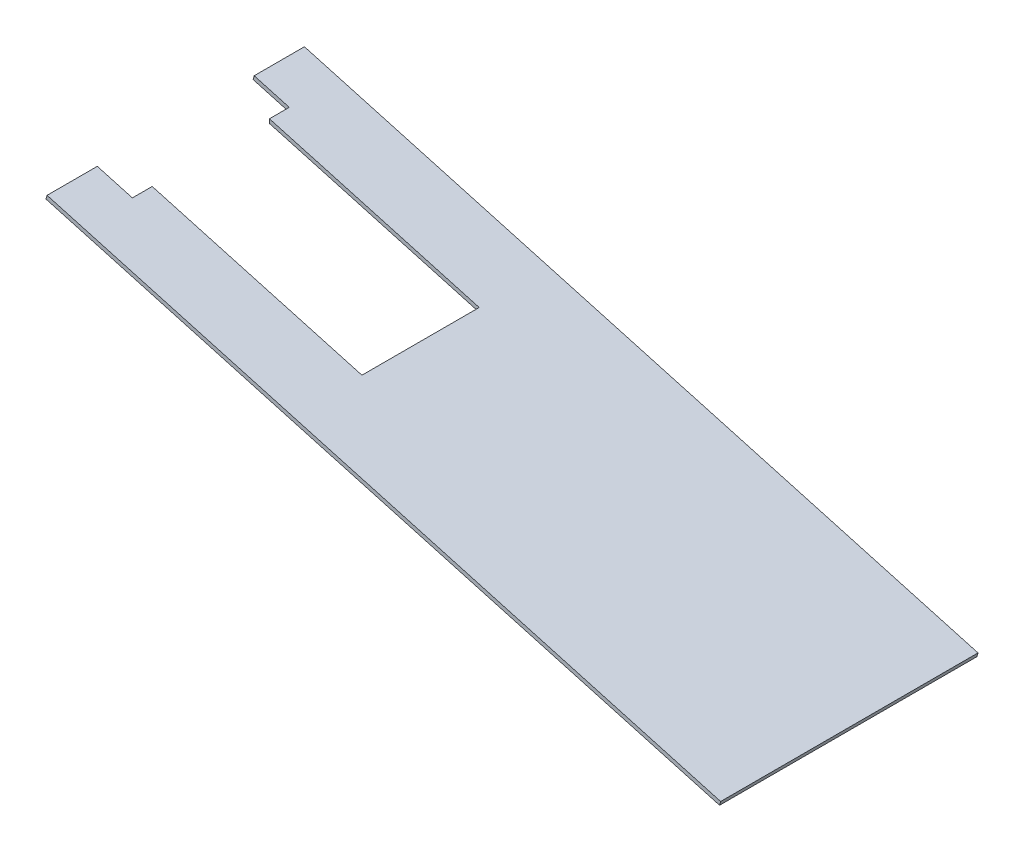
ISO-10303-21;
HEADER;
FILE_DESCRIPTION(('STEP AP214'),'2;1');
FILE_NAME('part.step','',(''),(''),'','','');
FILE_SCHEMA(('AUTOMOTIVE_DESIGN { 1 0 10303 214 1 1 1 1 }'));
ENDSEC;
DATA;
#1=APPLICATION_CONTEXT('core data for automotive mechanical design processes');
#2=APPLICATION_PROTOCOL_DEFINITION('international standard','automotive_design',2000,#1);
#3=PRODUCT_CONTEXT('',#1,'mechanical');
#4=PRODUCT('Part','Part','',(#3));
#5=PRODUCT_RELATED_PRODUCT_CATEGORY('part','',(#4));
#6=PRODUCT_DEFINITION_FORMATION('','',#4);
#7=PRODUCT_DEFINITION_CONTEXT('part definition',#1,'design');
#8=PRODUCT_DEFINITION('design','',#6,#7);
#9=PRODUCT_DEFINITION_SHAPE('','',#8);
#10=(LENGTH_UNIT() NAMED_UNIT(*) SI_UNIT(.MILLI.,.METRE.));
#11=(NAMED_UNIT(*) PLANE_ANGLE_UNIT() SI_UNIT($,.RADIAN.));
#12=(NAMED_UNIT(*) SI_UNIT($,.STERADIAN.) SOLID_ANGLE_UNIT());
#13=UNCERTAINTY_MEASURE_WITH_UNIT(LENGTH_MEASURE(1.E-05),#10,'distance_accuracy_value','');
#14=(GEOMETRIC_REPRESENTATION_CONTEXT(3) GLOBAL_UNCERTAINTY_ASSIGNED_CONTEXT((#13)) GLOBAL_UNIT_ASSIGNED_CONTEXT((#10,
#11,#12)) REPRESENTATION_CONTEXT('',''));
#15=CARTESIAN_POINT('',(0.,0.,0.));
#16=DIRECTION('',(0.,0.,1.));
#17=DIRECTION('',(1.,0.,0.));
#18=AXIS2_PLACEMENT_3D('',#15,#16,#17);
#19=CARTESIAN_POINT('',(-63.4786859186257,0.,0.));
#20=DIRECTION('',(1.,0.,0.));
#21=DIRECTION('',(0.,1.,0.));
#22=AXIS2_PLACEMENT_3D('',#19,#20,#21);
#23=PLANE('',#22);
#24=DIRECTION('',(0.,0.,-1.));
#25=VECTOR('',#24,1.);
#26=CARTESIAN_POINT('',(-63.4786859186257,42.8489765519579,130.));
#27=LINE('',#26,#25);
#28=CARTESIAN_POINT('',(-63.4786859186257,42.8489765519579,35.3784747554512));
#29=VERTEX_POINT('',#28);
#30=CARTESIAN_POINT('',(-63.4786859186258,42.8489765519579,25.3784747554512));
#31=VERTEX_POINT('',#30);
#32=EDGE_CURVE('E199',#29,#31,#27,.T.);
#33=ORIENTED_EDGE('',*,*,#32,.F.);
#34=DIRECTION('',(0.,1.,0.));
#35=VECTOR('',#34,1.);
#36=CARTESIAN_POINT('',(-63.4786859186257,0.,35.3784747554512));
#37=LINE('',#36,#35);
#38=CARTESIAN_POINT('',(-63.4786859186257,44.9255362360795,35.3784747554512));
#39=VERTEX_POINT('',#38);
#40=EDGE_CURVE('E11',#29,#39,#37,.T.);
#41=ORIENTED_EDGE('',*,*,#40,.T.);
#42=DIRECTION('',(0.,0.,1.));
#43=VECTOR('',#42,1.);
#44=CARTESIAN_POINT('',(-63.4786859186257,44.9255362360795,130.));
#45=LINE('',#44,#43);
#46=CARTESIAN_POINT('',(-63.4786859186258,44.9255362360795,25.3784747554512));
#47=VERTEX_POINT('',#46);
#48=EDGE_CURVE('E163',#47,#39,#45,.T.);
#49=ORIENTED_EDGE('',*,*,#48,.F.);
#50=DIRECTION('',(0.,-1.,0.));
#51=VECTOR('',#50,1.);
#52=CARTESIAN_POINT('',(-63.4786859186258,57.5782483332973,25.3784747554512));
#53=LINE('',#52,#51);
#54=EDGE_CURVE('E235',#47,#31,#53,.T.);
#55=ORIENTED_EDGE('',*,*,#54,.T.);
#56=EDGE_LOOP('',(#33,#41,#49,#55));
#57=FACE_BOUND('',#56,.T.);
#58=ADVANCED_FACE('F48',(#57),#23,.F.);
#59=CARTESIAN_POINT('',(-99.346696613791,52.8679739528421,130.));
#60=DIRECTION('',(0.269031139412408,0.963131479096422,0.));
#61=DIRECTION('',(-0.963131479096422,0.269031139412408,0.));
#62=AXIS2_PLACEMENT_3D('',#59,#60,#61);
#63=PLANE('',#62);
#64=DIRECTION('',(0.,0.,-1.));
#65=VECTOR('',#64,1.);
#66=CARTESIAN_POINT('',(41.9277145031559,13.4058479425217,130.));
#67=LINE('',#66,#65);
#68=CARTESIAN_POINT('',(41.9277145031559,13.4058479425217,94.6215252445487));
#69=VERTEX_POINT('',#68);
#70=CARTESIAN_POINT('',(41.9277145031558,13.4058479425217,35.3784747554512));
#71=VERTEX_POINT('',#70);
#72=EDGE_CURVE('E255',#69,#71,#67,.T.);
#73=ORIENTED_EDGE('',*,*,#72,.T.);
#74=DIRECTION('',(-0.963131479096422,0.269031139412408,0.));
#75=VECTOR('',#74,1.);
#76=CARTESIAN_POINT('',(-99.346696613791,52.8679739528421,35.3784747554512));
#77=LINE('',#76,#75);
#78=EDGE_CURVE('E259',#71,#29,#77,.T.);
#79=ORIENTED_EDGE('',*,*,#78,.T.);
#80=ORIENTED_EDGE('',*,*,#32,.T.);
#81=DIRECTION('',(-0.963131479096422,0.269031139412408,0.));
#82=VECTOR('',#81,1.);
#83=CARTESIAN_POINT('',(-99.346696613791,52.8679739528421,25.3784747554512));
#84=LINE('',#83,#82);
#85=CARTESIAN_POINT('',(-81.7434214219124,47.950857977457,25.3784747554512));
#86=VERTEX_POINT('',#85);
#87=EDGE_CURVE('E187',#31,#86,#84,.T.);
#88=ORIENTED_EDGE('',*,*,#87,.T.);
#89=DIRECTION('',(0.,0.,-1.));
#90=VECTOR('',#89,1.);
#91=CARTESIAN_POINT('',(-81.7434214219124,47.950857977457,130.));
#92=LINE('',#91,#90);
#93=CARTESIAN_POINT('',(-81.7434214219124,47.950857977457,0.));
#94=VERTEX_POINT('',#93);
#95=EDGE_CURVE('E72',#86,#94,#92,.T.);
#96=ORIENTED_EDGE('',*,*,#95,.T.);
#97=DIRECTION('',(0.963131479096422,-0.269031139412408,0.));
#98=VECTOR('',#97,1.);
#99=CARTESIAN_POINT('',(-99.346696613791,52.8679739528421,0.));
#100=LINE('',#99,#98);
#101=CARTESIAN_POINT('',(258.521314081374,-47.0951575262544,0.));
#102=VERTEX_POINT('',#101);
#103=EDGE_CURVE('E203',#94,#102,#100,.T.);
#104=ORIENTED_EDGE('',*,*,#103,.T.);
#105=DIRECTION('',(0.,0.,-1.));
#106=VECTOR('',#105,1.);
#107=CARTESIAN_POINT('',(258.521314081374,-47.0951575262544,130.));
#108=LINE('',#107,#106);
#109=CARTESIAN_POINT('',(258.521314081374,-47.0951575262544,130.));
#110=VERTEX_POINT('',#109);
#111=EDGE_CURVE('E164',#110,#102,#108,.T.);
#112=ORIENTED_EDGE('',*,*,#111,.F.);
#113=DIRECTION('',(0.963131479096422,-0.269031139412408,0.));
#114=VECTOR('',#113,1.);
#115=CARTESIAN_POINT('',(-99.346696613791,52.8679739528421,130.));
#116=LINE('',#115,#114);
#117=CARTESIAN_POINT('',(-81.7434214219124,47.950857977457,130.));
#118=VERTEX_POINT('',#117);
#119=EDGE_CURVE('E204',#118,#110,#116,.T.);
#120=ORIENTED_EDGE('',*,*,#119,.F.);
#121=CARTESIAN_POINT('',(-81.7434214219124,47.950857977457,104.621525244549));
#122=VERTEX_POINT('',#121);
#123=EDGE_CURVE('E243',#118,#122,#92,.T.);
#124=ORIENTED_EDGE('',*,*,#123,.T.);
#125=DIRECTION('',(0.963131479096422,-0.269031139412408,0.));
#126=VECTOR('',#125,1.);
#127=CARTESIAN_POINT('',(-99.346696613791,52.8679739528421,104.621525244549));
#128=LINE('',#127,#126);
#129=CARTESIAN_POINT('',(-63.4786859186258,42.8489765519579,104.621525244549));
#130=VERTEX_POINT('',#129);
#131=EDGE_CURVE('E179',#122,#130,#128,.T.);
#132=ORIENTED_EDGE('',*,*,#131,.T.);
#133=CARTESIAN_POINT('',(-63.4786859186257,42.8489765519579,94.6215252445488));
#134=VERTEX_POINT('',#133);
#135=EDGE_CURVE('E200',#130,#134,#27,.T.);
#136=ORIENTED_EDGE('',*,*,#135,.T.);
#137=DIRECTION('',(0.963131479096422,-0.269031139412408,0.));
#138=VECTOR('',#137,1.);
#139=CARTESIAN_POINT('',(-99.346696613791,52.8679739528421,94.6215252445487));
#140=LINE('',#139,#138);
#141=EDGE_CURVE('E64',#134,#69,#140,.T.);
#142=ORIENTED_EDGE('',*,*,#141,.T.);
#143=EDGE_LOOP('',(#73,#79,#80,#88,#96,#104,#112,#120,#124,#132,#136,#142));
#144=FACE_BOUND('',#143,.T.);
#145=ADVANCED_FACE('F50',(#144),#63,.F.);
#146=CARTESIAN_POINT('',(258.521314081374,-47.0951575262544,130.));
#147=DIRECTION('',(-0.963131479096424,0.269031139412401,0.));
#148=DIRECTION('',(-0.269031139412401,-0.963131479096424,0.));
#149=AXIS2_PLACEMENT_3D('',#146,#147,#148);
#150=PLANE('',#149);
#151=DIRECTION('',(0.269031139412401,0.963131479096424,0.));
#152=VECTOR('',#151,1.);
#153=CARTESIAN_POINT('',(258.521314081374,-47.0951575262544,0.));
#154=LINE('',#153,#152);
#155=CARTESIAN_POINT('',(259.059376360199,-45.1688945680615,0.));
#156=VERTEX_POINT('',#155);
#157=EDGE_CURVE('E216',#102,#156,#154,.T.);
#158=ORIENTED_EDGE('',*,*,#157,.T.);
#159=DIRECTION('',(0.,0.,-1.));
#160=VECTOR('',#159,1.);
#161=CARTESIAN_POINT('',(259.059376360199,-45.1688945680615,130.));
#162=LINE('',#161,#160);
#163=CARTESIAN_POINT('',(259.059376360199,-45.1688945680615,130.));
#164=VERTEX_POINT('',#163);
#165=EDGE_CURVE('E169',#164,#156,#162,.T.);
#166=ORIENTED_EDGE('',*,*,#165,.F.);
#167=DIRECTION('',(0.269031139412401,0.963131479096424,0.));
#168=VECTOR('',#167,1.);
#169=CARTESIAN_POINT('',(258.521314081374,-47.0951575262544,130.));
#170=LINE('',#169,#168);
#171=EDGE_CURVE('E207',#110,#164,#170,.T.);
#172=ORIENTED_EDGE('',*,*,#171,.F.);
#173=ORIENTED_EDGE('',*,*,#111,.T.);
#174=EDGE_LOOP('',(#158,#166,#172,#173));
#175=FACE_BOUND('',#174,.T.);
#176=ADVANCED_FACE('F305',(#175),#150,.F.);
#177=CARTESIAN_POINT('',(259.059376360199,-45.1688945680615,130.));
#178=DIRECTION('',(-0.269031139412408,-0.963131479096422,0.));
#179=DIRECTION('',(0.963131479096422,-0.269031139412408,0.));
#180=AXIS2_PLACEMENT_3D('',#177,#178,#179);
#181=PLANE('',#180);
#182=ORIENTED_EDGE('',*,*,#48,.T.);
#183=DIRECTION('',(-0.963131479096422,0.269031139412408,0.));
#184=VECTOR('',#183,1.);
#185=CARTESIAN_POINT('',(-63.4786859186257,44.9255362360795,35.3784747554512));
#186=LINE('',#185,#184);
#187=CARTESIAN_POINT('',(42.4657767819807,15.3321109007146,35.3784747554512));
#188=VERTEX_POINT('',#187);
#189=EDGE_CURVE('E269',#188,#39,#186,.T.);
#190=ORIENTED_EDGE('',*,*,#189,.F.);
#191=DIRECTION('',(0.,0.,-1.));
#192=VECTOR('',#191,1.);
#193=CARTESIAN_POINT('',(42.4657767819807,15.3321109007146,35.3784747554512));
#194=LINE('',#193,#192);
#195=CARTESIAN_POINT('',(42.4657767819807,15.3321109007146,94.6215252445487));
#196=VERTEX_POINT('',#195);
#197=EDGE_CURVE('E155',#196,#188,#194,.T.);
#198=ORIENTED_EDGE('',*,*,#197,.F.);
#199=DIRECTION('',(0.963131479096422,-0.269031139412408,0.));
#200=VECTOR('',#199,1.);
#201=CARTESIAN_POINT('',(-63.4786859186257,44.9255362360795,94.6215252445487));
#202=LINE('',#201,#200);
#203=CARTESIAN_POINT('',(-63.4786859186257,44.9255362360795,94.6215252445487));
#204=VERTEX_POINT('',#203);
#205=EDGE_CURVE('E139',#204,#196,#202,.T.);
#206=ORIENTED_EDGE('',*,*,#205,.F.);
#207=CARTESIAN_POINT('',(-63.4786859186258,44.9255362360795,104.621525244549));
#208=VERTEX_POINT('',#207);
#209=EDGE_CURVE('E151',#204,#208,#45,.T.);
#210=ORIENTED_EDGE('',*,*,#209,.T.);
#211=DIRECTION('',(-0.963131479096422,0.269031139412408,0.));
#212=VECTOR('',#211,1.);
#213=CARTESIAN_POINT('',(259.059376360199,-45.1688945680615,104.621525244549));
#214=LINE('',#213,#212);
#215=CARTESIAN_POINT('',(-81.2053591430877,49.8771209356498,104.621525244549));
#216=VERTEX_POINT('',#215);
#217=EDGE_CURVE('E178',#208,#216,#214,.T.);
#218=ORIENTED_EDGE('',*,*,#217,.T.);
#219=DIRECTION('',(0.,0.,-1.));
#220=VECTOR('',#219,1.);
#221=CARTESIAN_POINT('',(-81.2053591430876,49.8771209356498,-39.8920945915401));
#222=LINE('',#221,#220);
#223=CARTESIAN_POINT('',(-81.2053591430876,49.8771209356498,130.));
#224=VERTEX_POINT('',#223);
#225=EDGE_CURVE('E184',#224,#216,#222,.T.);
#226=ORIENTED_EDGE('',*,*,#225,.F.);
#227=DIRECTION('',(-0.963131479096422,0.269031139412408,0.));
#228=VECTOR('',#227,1.);
#229=CARTESIAN_POINT('',(259.059376360199,-45.1688945680615,130.));
#230=LINE('',#229,#228);
#231=EDGE_CURVE('E211',#164,#224,#230,.T.);
#232=ORIENTED_EDGE('',*,*,#231,.F.);
#233=ORIENTED_EDGE('',*,*,#165,.T.);
#234=DIRECTION('',(-0.963131479096422,0.269031139412408,0.));
#235=VECTOR('',#234,1.);
#236=CARTESIAN_POINT('',(259.059376360199,-45.1688945680615,0.));
#237=LINE('',#236,#235);
#238=CARTESIAN_POINT('',(-81.2053591430876,49.8771209356498,0.));
#239=VERTEX_POINT('',#238);
#240=EDGE_CURVE('E208',#156,#239,#237,.T.);
#241=ORIENTED_EDGE('',*,*,#240,.T.);
#242=CARTESIAN_POINT('',(-81.2053591430876,49.8771209356498,25.3784747554512));
#243=VERTEX_POINT('',#242);
#244=EDGE_CURVE('E252',#243,#239,#222,.T.);
#245=ORIENTED_EDGE('',*,*,#244,.F.);
#246=DIRECTION('',(0.963131479096422,-0.269031139412408,0.));
#247=VECTOR('',#246,1.);
#248=CARTESIAN_POINT('',(259.059376360199,-45.1688945680615,25.3784747554512));
#249=LINE('',#248,#247);
#250=EDGE_CURVE('E192',#243,#47,#249,.T.);
#251=ORIENTED_EDGE('',*,*,#250,.T.);
#252=EDGE_LOOP('',(#182,#190,#198,#206,#210,#218,#226,#232,#233,#241,#245,#251));
#253=FACE_BOUND('',#252,.T.);
#254=ADVANCED_FACE('F149',(#253),#181,.F.);
#255=CARTESIAN_POINT('',(-99.6157277532034,51.9048424737456,130.));
#256=DIRECTION('',(0.,0.,1.));
#257=DIRECTION('',(1.,0.,0.));
#258=AXIS2_PLACEMENT_3D('',#255,#256,#257);
#259=PLANE('',#258);
#260=DIRECTION('',(0.269031139412408,0.963131479096422,0.));
#261=VECTOR('',#260,1.);
#262=CARTESIAN_POINT('',(-82.0124525613248,46.9877264983606,130.));
#263=LINE('',#262,#261);
#264=EDGE_CURVE('E248',#118,#224,#263,.T.);
#265=ORIENTED_EDGE('',*,*,#264,.F.);
#266=ORIENTED_EDGE('',*,*,#119,.T.);
#267=ORIENTED_EDGE('',*,*,#171,.T.);
#268=ORIENTED_EDGE('',*,*,#231,.T.);
#269=EDGE_LOOP('',(#265,#266,#267,#268));
#270=FACE_BOUND('',#269,.T.);
#271=ADVANCED_FACE('F314',(#270),#259,.T.);
#272=CARTESIAN_POINT('',(-99.6157277532034,51.9048424737456,0.));
#273=DIRECTION('',(0.,0.,1.));
#274=DIRECTION('',(1.,0.,0.));
#275=AXIS2_PLACEMENT_3D('',#272,#273,#274);
#276=PLANE('',#275);
#277=ORIENTED_EDGE('',*,*,#103,.F.);
#278=DIRECTION('',(0.269031139412408,0.963131479096422,0.));
#279=VECTOR('',#278,1.);
#280=CARTESIAN_POINT('',(-82.0124525613248,46.9877264983606,0.));
#281=LINE('',#280,#279);
#282=EDGE_CURVE('E233',#94,#239,#281,.T.);
#283=ORIENTED_EDGE('',*,*,#282,.T.);
#284=ORIENTED_EDGE('',*,*,#240,.F.);
#285=ORIENTED_EDGE('',*,*,#157,.F.);
#286=EDGE_LOOP('',(#277,#283,#284,#285));
#287=FACE_BOUND('',#286,.T.);
#288=ADVANCED_FACE('F232',(#287),#276,.F.);
#289=ORIENTED_EDGE('',*,*,#209,.F.);
#290=DIRECTION('',(0.,-1.,0.));
#291=VECTOR('',#290,1.);
#292=CARTESIAN_POINT('',(-63.4786859186257,0.,94.6215252445487));
#293=LINE('',#292,#291);
#294=EDGE_CURVE('E57',#204,#134,#293,.T.);
#295=ORIENTED_EDGE('',*,*,#294,.T.);
#296=ORIENTED_EDGE('',*,*,#135,.F.);
#297=DIRECTION('',(0.,1.,0.));
#298=VECTOR('',#297,1.);
#299=CARTESIAN_POINT('',(-63.4786859186258,57.5782483332973,104.621525244549));
#300=LINE('',#299,#298);
#301=EDGE_CURVE('E161',#130,#208,#300,.T.);
#302=ORIENTED_EDGE('',*,*,#301,.T.);
#303=EDGE_LOOP('',(#289,#295,#296,#302));
#304=FACE_BOUND('',#303,.T.);
#305=ADVANCED_FACE('F159',(#304),#23,.F.);
#306=CARTESIAN_POINT('',(-63.4786859186258,57.5782483332973,25.3784747554512));
#307=DIRECTION('',(0.,0.,-1.));
#308=DIRECTION('',(0.,1.,0.));
#309=AXIS2_PLACEMENT_3D('',#306,#307,#308);
#310=PLANE('',#309);
#311=ORIENTED_EDGE('',*,*,#250,.F.);
#312=DIRECTION('',(-0.269031139412408,-0.963131479096422,0.));
#313=VECTOR('',#312,1.);
#314=CARTESIAN_POINT('',(-77.9268850609794,61.6140581495972,25.3784747554512));
#315=LINE('',#314,#313);
#316=EDGE_CURVE('E241',#243,#86,#315,.T.);
#317=ORIENTED_EDGE('',*,*,#316,.T.);
#318=ORIENTED_EDGE('',*,*,#87,.F.);
#319=ORIENTED_EDGE('',*,*,#54,.F.);
#320=EDGE_LOOP('',(#311,#317,#318,#319));
#321=FACE_BOUND('',#320,.T.);
#322=ADVANCED_FACE('F289',(#321),#310,.F.);
#323=CARTESIAN_POINT('',(-63.4786859186258,57.5782483332973,104.621525244549));
#324=DIRECTION('',(0.,0.,1.));
#325=DIRECTION('',(0.,-1.,0.));
#326=AXIS2_PLACEMENT_3D('',#323,#324,#325);
#327=PLANE('',#326);
#328=ORIENTED_EDGE('',*,*,#131,.F.);
#329=DIRECTION('',(0.269031139412408,0.963131479096422,0.));
#330=VECTOR('',#329,1.);
#331=CARTESIAN_POINT('',(-77.9268850609794,61.6140581495972,104.621525244549));
#332=LINE('',#331,#330);
#333=EDGE_CURVE('E146',#122,#216,#332,.T.);
#334=ORIENTED_EDGE('',*,*,#333,.T.);
#335=ORIENTED_EDGE('',*,*,#217,.F.);
#336=ORIENTED_EDGE('',*,*,#301,.F.);
#337=EDGE_LOOP('',(#328,#334,#335,#336));
#338=FACE_BOUND('',#337,.T.);
#339=ADVANCED_FACE('F177',(#338),#327,.F.);
#340=CARTESIAN_POINT('',(-107.741910597599,-45.1237332715003,-39.8920945915401));
#341=DIRECTION('',(0.963131479096422,-0.269031139412408,0.));
#342=DIRECTION('',(0.269031139412408,0.963131479096422,0.));
#343=AXIS2_PLACEMENT_3D('',#340,#341,#342);
#344=PLANE('',#343);
#345=ORIENTED_EDGE('',*,*,#264,.T.);
#346=ORIENTED_EDGE('',*,*,#225,.T.);
#347=ORIENTED_EDGE('',*,*,#333,.F.);
#348=ORIENTED_EDGE('',*,*,#123,.F.);
#349=EDGE_LOOP('',(#345,#346,#347,#348));
#350=FACE_BOUND('',#349,.T.);
#351=ADVANCED_FACE('F292',(#350),#344,.F.);
#352=ORIENTED_EDGE('',*,*,#95,.F.);
#353=ORIENTED_EDGE('',*,*,#316,.F.);
#354=ORIENTED_EDGE('',*,*,#244,.T.);
#355=ORIENTED_EDGE('',*,*,#282,.F.);
#356=EDGE_LOOP('',(#352,#353,#354,#355));
#357=FACE_BOUND('',#356,.T.);
#358=ADVANCED_FACE('F290',(#357),#344,.F.);
#359=CARTESIAN_POINT('',(17.3001171910277,-74.7609504348969,35.3784747554512));
#360=DIRECTION('',(0.963131479096422,-0.269031139412408,0.));
#361=DIRECTION('',(0.269031139412408,0.963131479096422,0.));
#362=AXIS2_PLACEMENT_3D('',#359,#360,#361);
#363=PLANE('',#362);
#364=DIRECTION('',(0.269031139412408,0.963131479096422,0.));
#365=VECTOR('',#364,1.);
#366=CARTESIAN_POINT('',(17.3001171910278,-74.7609504348969,94.6215252445487));
#367=LINE('',#366,#365);
#368=EDGE_CURVE('E266',#69,#196,#367,.T.);
#369=ORIENTED_EDGE('',*,*,#368,.T.);
#370=ORIENTED_EDGE('',*,*,#197,.T.);
#371=DIRECTION('',(0.269031139412408,0.963131479096422,0.));
#372=VECTOR('',#371,1.);
#373=CARTESIAN_POINT('',(17.3001171910277,-74.7609504348969,35.3784747554512));
#374=LINE('',#373,#372);
#375=EDGE_CURVE('E265',#71,#188,#374,.T.);
#376=ORIENTED_EDGE('',*,*,#375,.F.);
#377=ORIENTED_EDGE('',*,*,#72,.F.);
#378=EDGE_LOOP('',(#369,#370,#376,#377));
#379=FACE_BOUND('',#378,.T.);
#380=ADVANCED_FACE('F277',(#379),#363,.F.);
#381=CARTESIAN_POINT('',(-88.6443455095787,-45.1675250995319,35.3784747554512));
#382=DIRECTION('',(0.,0.,-1.));
#383=DIRECTION('',(-1.,0.,0.));
#384=AXIS2_PLACEMENT_3D('',#381,#382,#383);
#385=PLANE('',#384);
#386=ORIENTED_EDGE('',*,*,#375,.T.);
#387=ORIENTED_EDGE('',*,*,#189,.T.);
#388=ORIENTED_EDGE('',*,*,#40,.F.);
#389=ORIENTED_EDGE('',*,*,#78,.F.);
#390=EDGE_LOOP('',(#386,#387,#388,#389));
#391=FACE_BOUND('',#390,.T.);
#392=ADVANCED_FACE('F280',(#391),#385,.F.);
#393=CARTESIAN_POINT('',(-88.6443455095786,-45.167525099532,94.6215252445487));
#394=DIRECTION('',(0.,0.,1.));
#395=DIRECTION('',(1.,0.,0.));
#396=AXIS2_PLACEMENT_3D('',#393,#394,#395);
#397=PLANE('',#396);
#398=ORIENTED_EDGE('',*,*,#294,.F.);
#399=ORIENTED_EDGE('',*,*,#205,.T.);
#400=ORIENTED_EDGE('',*,*,#368,.F.);
#401=ORIENTED_EDGE('',*,*,#141,.F.);
#402=EDGE_LOOP('',(#398,#399,#400,#401));
#403=FACE_BOUND('',#402,.T.);
#404=ADVANCED_FACE('F138',(#403),#397,.F.);
#405=CLOSED_SHELL('',(#58,#145,#176,#254,#271,#288,#305,#322,#339,#351,#358,#380,#392,#404));
#406=MANIFOLD_SOLID_BREP('B2',#405);
#407=ADVANCED_BREP_SHAPE_REPRESENTATION('',(#18,#406),#14);
#408=SHAPE_DEFINITION_REPRESENTATION(#9,#407);
ENDSEC;
END-ISO-10303-21;
